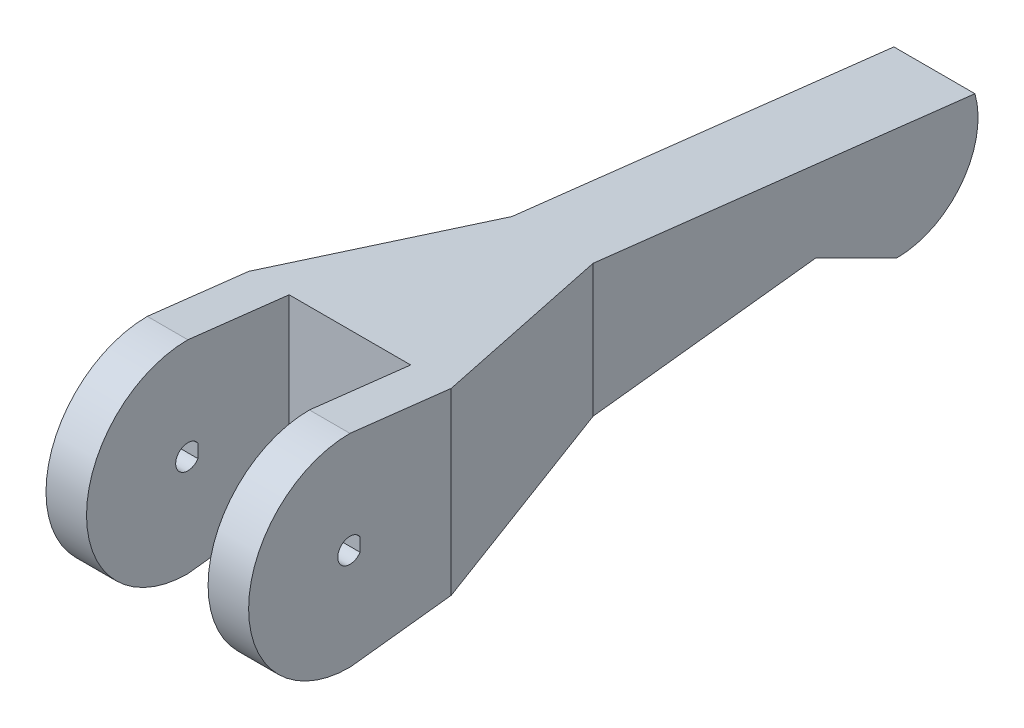
ISO-10303-21;
HEADER;
FILE_DESCRIPTION(('STEP AP214'),'2;1');
FILE_NAME('part.step','',(''),(''),'','','');
FILE_SCHEMA(('AUTOMOTIVE_DESIGN { 1 0 10303 214 1 1 1 1 }'));
ENDSEC;
DATA;
#1=APPLICATION_CONTEXT('core data for automotive mechanical design processes');
#2=APPLICATION_PROTOCOL_DEFINITION('international standard','automotive_design',2000,#1);
#3=PRODUCT_CONTEXT('',#1,'mechanical');
#4=PRODUCT('Part','Part','',(#3));
#5=PRODUCT_RELATED_PRODUCT_CATEGORY('part','',(#4));
#6=PRODUCT_DEFINITION_FORMATION('','',#4);
#7=PRODUCT_DEFINITION_CONTEXT('part definition',#1,'design');
#8=PRODUCT_DEFINITION('design','',#6,#7);
#9=PRODUCT_DEFINITION_SHAPE('','',#8);
#10=(LENGTH_UNIT() NAMED_UNIT(*) SI_UNIT(.MILLI.,.METRE.));
#11=(NAMED_UNIT(*) PLANE_ANGLE_UNIT() SI_UNIT($,.RADIAN.));
#12=(NAMED_UNIT(*) SI_UNIT($,.STERADIAN.) SOLID_ANGLE_UNIT());
#13=UNCERTAINTY_MEASURE_WITH_UNIT(LENGTH_MEASURE(1.E-05),#10,'distance_accuracy_value','');
#14=(GEOMETRIC_REPRESENTATION_CONTEXT(3) GLOBAL_UNCERTAINTY_ASSIGNED_CONTEXT((#13)) GLOBAL_UNIT_ASSIGNED_CONTEXT((#10,
#11,#12)) REPRESENTATION_CONTEXT('',''));
#15=CARTESIAN_POINT('',(0.,0.,0.));
#16=DIRECTION('',(0.,0.,1.));
#17=DIRECTION('',(1.,0.,0.));
#18=AXIS2_PLACEMENT_3D('',#15,#16,#17);
#19=CARTESIAN_POINT('',(50.,0.,0.));
#20=DIRECTION('',(-1.,0.,0.));
#21=DIRECTION('',(0.,0.,1.));
#22=AXIS2_PLACEMENT_3D('',#19,#20,#21);
#23=CYLINDRICAL_SURFACE('',#22,25.);
#24=DIRECTION('',(-1.,0.,0.));
#25=VECTOR('',#24,1.);
#26=CARTESIAN_POINT('',(50.,25.,0.));
#27=LINE('',#26,#25);
#28=CARTESIAN_POINT('',(50.,25.,0.));
#29=VERTEX_POINT('',#28);
#30=CARTESIAN_POINT('',(40.,25.,0.));
#31=VERTEX_POINT('',#30);
#32=EDGE_CURVE('E255',#29,#31,#27,.T.);
#33=ORIENTED_EDGE('',*,*,#32,.T.);
#34=CARTESIAN_POINT('',(40.,0.,0.));
#35=DIRECTION('',(1.,0.,0.));
#36=DIRECTION('',(0.,0.,-1.));
#37=AXIS2_PLACEMENT_3D('',#34,#35,#36);
#38=CIRCLE('',#37,25.);
#39=CARTESIAN_POINT('',(40.,-25.,0.));
#40=VERTEX_POINT('',#39);
#41=EDGE_CURVE('E196',#31,#40,#38,.T.);
#42=ORIENTED_EDGE('',*,*,#41,.T.);
#43=DIRECTION('',(-1.,0.,0.));
#44=VECTOR('',#43,1.);
#45=CARTESIAN_POINT('',(50.,-25.,0.));
#46=LINE('',#45,#44);
#47=CARTESIAN_POINT('',(50.,-25.,0.));
#48=VERTEX_POINT('',#47);
#49=EDGE_CURVE('E265',#48,#40,#46,.T.);
#50=ORIENTED_EDGE('',*,*,#49,.F.);
#51=CARTESIAN_POINT('',(50.,0.,0.));
#52=DIRECTION('',(1.,0.,0.));
#53=DIRECTION('',(0.,0.,-1.));
#54=AXIS2_PLACEMENT_3D('',#51,#52,#53);
#55=CIRCLE('',#54,25.);
#56=EDGE_CURVE('E238',#29,#48,#55,.T.);
#57=ORIENTED_EDGE('',*,*,#56,.F.);
#58=EDGE_LOOP('',(#33,#42,#50,#57));
#59=FACE_BOUND('',#58,.T.);
#60=ADVANCED_FACE('F37',(#59),#23,.T.);
#61=CARTESIAN_POINT('',(10.,0.,0.));
#62=DIRECTION('',(-1.,0.,0.));
#63=DIRECTION('',(0.,0.,1.));
#64=AXIS2_PLACEMENT_3D('',#61,#62,#63);
#65=CIRCLE('',#64,25.);
#66=CARTESIAN_POINT('',(10.,-25.,0.));
#67=VERTEX_POINT('',#66);
#68=CARTESIAN_POINT('',(10.,25.,0.));
#69=VERTEX_POINT('',#68);
#70=EDGE_CURVE('E191',#67,#69,#65,.T.);
#71=ORIENTED_EDGE('',*,*,#70,.T.);
#72=CARTESIAN_POINT('',(0.,25.,0.));
#73=VERTEX_POINT('',#72);
#74=EDGE_CURVE('E247',#69,#73,#27,.T.);
#75=ORIENTED_EDGE('',*,*,#74,.T.);
#76=CARTESIAN_POINT('',(0.,0.,0.));
#77=DIRECTION('',(1.,0.,0.));
#78=DIRECTION('',(0.,0.,-1.));
#79=AXIS2_PLACEMENT_3D('',#76,#77,#78);
#80=CIRCLE('',#79,25.);
#81=CARTESIAN_POINT('',(0.,-25.,0.));
#82=VERTEX_POINT('',#81);
#83=EDGE_CURVE('E237',#73,#82,#80,.T.);
#84=ORIENTED_EDGE('',*,*,#83,.T.);
#85=EDGE_CURVE('E264',#67,#82,#46,.T.);
#86=ORIENTED_EDGE('',*,*,#85,.F.);
#87=EDGE_LOOP('',(#71,#75,#84,#86));
#88=FACE_BOUND('',#87,.T.);
#89=ADVANCED_FACE('F39',(#88),#23,.T.);
#90=CARTESIAN_POINT('',(50.,-25.,0.));
#91=DIRECTION('',(0.,0.993408935871131,0.114624107985131));
#92=DIRECTION('',(0.,-0.114624107985131,0.993408935871131));
#93=AXIS2_PLACEMENT_3D('',#90,#91,#92);
#94=PLANE('',#93);
#95=ORIENTED_EDGE('',*,*,#49,.T.);
#96=DIRECTION('',(0.,0.114624107985131,-0.993408935871131));
#97=VECTOR('',#96,1.);
#98=CARTESIAN_POINT('',(40.,-25.,0.));
#99=LINE('',#98,#97);
#100=CARTESIAN_POINT('',(40.,-22.1153846153846,-25.));
#101=VERTEX_POINT('',#100);
#102=EDGE_CURVE('E199',#40,#101,#99,.T.);
#103=ORIENTED_EDGE('',*,*,#102,.T.);
#104=DIRECTION('',(-1.,0.,0.));
#105=VECTOR('',#104,1.);
#106=CARTESIAN_POINT('',(50.,-22.1153846153846,-25.));
#107=LINE('',#106,#105);
#108=CARTESIAN_POINT('',(10.,-22.1153846153846,-25.));
#109=VERTEX_POINT('',#108);
#110=EDGE_CURVE('E187',#101,#109,#107,.T.);
#111=ORIENTED_EDGE('',*,*,#110,.T.);
#112=DIRECTION('',(0.,-0.114624107985131,0.993408935871131));
#113=VECTOR('',#112,1.);
#114=CARTESIAN_POINT('',(10.,-25.,0.));
#115=LINE('',#114,#113);
#116=EDGE_CURVE('E193',#109,#67,#115,.T.);
#117=ORIENTED_EDGE('',*,*,#116,.T.);
#118=ORIENTED_EDGE('',*,*,#85,.T.);
#119=DIRECTION('',(0.,0.114624107985131,-0.993408935871131));
#120=VECTOR('',#119,1.);
#121=CARTESIAN_POINT('',(0.,-25.,0.));
#122=LINE('',#121,#120);
#123=CARTESIAN_POINT('',(0.,-22.1153846153846,-25.));
#124=VERTEX_POINT('',#123);
#125=EDGE_CURVE('E250',#82,#124,#122,.T.);
#126=ORIENTED_EDGE('',*,*,#125,.T.);
#127=DIRECTION('',(0.285608920060766,0.109849584638756,-0.952029733535889));
#128=VECTOR('',#127,1.);
#129=CARTESIAN_POINT('',(-2.80958382494904,-23.1959937788266,-15.6347205835031));
#130=LINE('',#129,#128);
#131=CARTESIAN_POINT('',(15.,-16.3461538461538,-75.));
#132=VERTEX_POINT('',#131);
#133=EDGE_CURVE('E211',#124,#132,#130,.T.);
#134=ORIENTED_EDGE('',*,*,#133,.T.);
#135=DIRECTION('',(0.,0.114624107985131,-0.993408935871131));
#136=VECTOR('',#135,1.);
#137=CARTESIAN_POINT('',(15.,-25.,0.));
#138=LINE('',#137,#136);
#139=CARTESIAN_POINT('',(15.,-10.,-130.));
#140=VERTEX_POINT('',#139);
#141=EDGE_CURVE('E234',#132,#140,#138,.T.);
#142=ORIENTED_EDGE('',*,*,#141,.T.);
#143=DIRECTION('',(-1.,0.,0.));
#144=VECTOR('',#143,1.);
#145=CARTESIAN_POINT('',(50.,-10.,-130.));
#146=LINE('',#145,#144);
#147=CARTESIAN_POINT('',(35.,-10.,-130.));
#148=VERTEX_POINT('',#147);
#149=EDGE_CURVE('E261',#148,#140,#146,.T.);
#150=ORIENTED_EDGE('',*,*,#149,.F.);
#151=DIRECTION('',(0.,-0.114624107985131,0.993408935871131));
#152=VECTOR('',#151,1.);
#153=CARTESIAN_POINT('',(35.,-25.,0.));
#154=LINE('',#153,#152);
#155=CARTESIAN_POINT('',(35.,-16.3461538461538,-75.));
#156=VERTEX_POINT('',#155);
#157=EDGE_CURVE('E225',#148,#156,#154,.T.);
#158=ORIENTED_EDGE('',*,*,#157,.T.);
#159=DIRECTION('',(0.285608920060766,-0.109849584638756,0.952029733535889));
#160=VECTOR('',#159,1.);
#161=CARTESIAN_POINT('',(56.8882065858629,-24.7646948407165,-2.03931138045693));
#162=LINE('',#161,#160);
#163=CARTESIAN_POINT('',(50.,-22.1153846153846,-25.));
#164=VERTEX_POINT('',#163);
#165=EDGE_CURVE('E217',#156,#164,#162,.T.);
#166=ORIENTED_EDGE('',*,*,#165,.T.);
#167=DIRECTION('',(0.,0.114624107985131,-0.993408935871131));
#168=VECTOR('',#167,1.);
#169=CARTESIAN_POINT('',(50.,-25.,0.));
#170=LINE('',#169,#168);
#171=EDGE_CURVE('E241',#48,#164,#170,.T.);
#172=ORIENTED_EDGE('',*,*,#171,.F.);
#173=EDGE_LOOP('',(#95,#103,#111,#117,#118,#126,#134,#142,#150,#158,#166,#172));
#174=FACE_BOUND('',#173,.T.);
#175=ADVANCED_FACE('F316',(#174),#94,.F.);
#176=CARTESIAN_POINT('',(50.,-10.,-130.));
#177=DIRECTION('',(0.,0.894427190999916,-0.447213595499958));
#178=DIRECTION('',(0.,0.447213595499958,0.894427190999916));
#179=AXIS2_PLACEMENT_3D('',#176,#177,#178);
#180=PLANE('',#179);
#181=ORIENTED_EDGE('',*,*,#149,.T.);
#182=DIRECTION('',(0.,-0.447213595499958,-0.894427190999916));
#183=VECTOR('',#182,1.);
#184=CARTESIAN_POINT('',(15.,-10.,-130.));
#185=LINE('',#184,#183);
#186=CARTESIAN_POINT('',(15.,-20.,-150.));
#187=VERTEX_POINT('',#186);
#188=EDGE_CURVE('E231',#140,#187,#185,.T.);
#189=ORIENTED_EDGE('',*,*,#188,.T.);
#190=DIRECTION('',(-1.,0.,0.));
#191=VECTOR('',#190,1.);
#192=CARTESIAN_POINT('',(50.,-20.,-150.));
#193=LINE('',#192,#191);
#194=CARTESIAN_POINT('',(35.,-20.,-150.));
#195=VERTEX_POINT('',#194);
#196=EDGE_CURVE('E258',#195,#187,#193,.T.);
#197=ORIENTED_EDGE('',*,*,#196,.F.);
#198=DIRECTION('',(0.,0.447213595499958,0.894427190999916));
#199=VECTOR('',#198,1.);
#200=CARTESIAN_POINT('',(35.,-10.,-130.));
#201=LINE('',#200,#199);
#202=EDGE_CURVE('E222',#195,#148,#201,.T.);
#203=ORIENTED_EDGE('',*,*,#202,.T.);
#204=EDGE_LOOP('',(#181,#189,#197,#203));
#205=FACE_BOUND('',#204,.T.);
#206=ADVANCED_FACE('F331',(#205),#180,.F.);
#207=CARTESIAN_POINT('',(50.,0.,-150.));
#208=DIRECTION('',(-1.,0.,0.));
#209=DIRECTION('',(0.,0.,1.));
#210=AXIS2_PLACEMENT_3D('',#207,#208,#209);
#211=CYLINDRICAL_SURFACE('',#210,20.);
#212=CARTESIAN_POINT('',(15.,0.,-150.));
#213=DIRECTION('',(1.,0.,0.));
#214=DIRECTION('',(0.,0.,-1.));
#215=AXIS2_PLACEMENT_3D('',#212,#213,#214);
#216=CIRCLE('',#215,20.);
#217=CARTESIAN_POINT('',(15.,5.47269139460768,-169.236674580067));
#218=VERTEX_POINT('',#217);
#219=EDGE_CURVE('E228',#187,#218,#216,.T.);
#220=ORIENTED_EDGE('',*,*,#219,.T.);
#221=DIRECTION('',(-1.,0.,0.));
#222=VECTOR('',#221,1.);
#223=CARTESIAN_POINT('',(50.,5.47269139460768,-169.236674580067));
#224=LINE('',#223,#222);
#225=CARTESIAN_POINT('',(35.,5.47269139460768,-169.236674580067));
#226=VERTEX_POINT('',#225);
#227=EDGE_CURVE('E180',#218,#226,#224,.F.);
#228=ORIENTED_EDGE('',*,*,#227,.T.);
#229=CARTESIAN_POINT('',(35.,0.,-150.));
#230=DIRECTION('',(-1.,0.,0.));
#231=DIRECTION('',(0.,0.,1.));
#232=AXIS2_PLACEMENT_3D('',#229,#230,#231);
#233=CIRCLE('',#232,20.);
#234=EDGE_CURVE('E220',#226,#195,#233,.T.);
#235=ORIENTED_EDGE('',*,*,#234,.T.);
#236=ORIENTED_EDGE('',*,*,#196,.T.);
#237=EDGE_LOOP('',(#220,#228,#235,#236));
#238=FACE_BOUND('',#237,.T.);
#239=ADVANCED_FACE('F326',(#238),#211,.T.);
#240=CARTESIAN_POINT('',(50.,25.,0.));
#241=DIRECTION('',(0.,-0.993408935871131,0.114624107985131));
#242=DIRECTION('',(0.,-0.114624107985131,-0.993408935871131));
#243=AXIS2_PLACEMENT_3D('',#240,#241,#242);
#244=PLANE('',#243);
#245=DIRECTION('',(1.,0.,0.));
#246=VECTOR('',#245,1.);
#247=CARTESIAN_POINT('',(50.,22.1153846153846,-25.));
#248=LINE('',#247,#246);
#249=CARTESIAN_POINT('',(10.,22.1153846153846,-25.));
#250=VERTEX_POINT('',#249);
#251=CARTESIAN_POINT('',(40.,22.1153846153846,-25.));
#252=VERTEX_POINT('',#251);
#253=EDGE_CURVE('E278',#250,#252,#248,.T.);
#254=ORIENTED_EDGE('',*,*,#253,.T.);
#255=DIRECTION('',(0.,0.114624107985131,0.993408935871131));
#256=VECTOR('',#255,1.);
#257=CARTESIAN_POINT('',(40.,25.,0.));
#258=LINE('',#257,#256);
#259=EDGE_CURVE('E284',#252,#31,#258,.T.);
#260=ORIENTED_EDGE('',*,*,#259,.T.);
#261=ORIENTED_EDGE('',*,*,#32,.F.);
#262=DIRECTION('',(0.,0.114624107985131,0.993408935871131));
#263=VECTOR('',#262,1.);
#264=CARTESIAN_POINT('',(50.,25.,0.));
#265=LINE('',#264,#263);
#266=CARTESIAN_POINT('',(50.,22.1153846153846,-25.));
#267=VERTEX_POINT('',#266);
#268=EDGE_CURVE('E245',#267,#29,#265,.T.);
#269=ORIENTED_EDGE('',*,*,#268,.F.);
#270=DIRECTION('',(-0.285608920060766,-0.109849584638756,-0.952029733535889));
#271=VECTOR('',#270,1.);
#272=CARTESIAN_POINT('',(56.8882065858629,24.7646948407165,-2.03931138045693));
#273=LINE('',#272,#271);
#274=CARTESIAN_POINT('',(35.,16.3461538461538,-75.));
#275=VERTEX_POINT('',#274);
#276=EDGE_CURVE('E214',#267,#275,#273,.T.);
#277=ORIENTED_EDGE('',*,*,#276,.T.);
#278=DIRECTION('',(0.,-0.114624107985131,-0.993408935871131));
#279=VECTOR('',#278,1.);
#280=CARTESIAN_POINT('',(35.,25.,0.));
#281=LINE('',#280,#279);
#282=EDGE_CURVE('E273',#275,#226,#281,.T.);
#283=ORIENTED_EDGE('',*,*,#282,.T.);
#284=ORIENTED_EDGE('',*,*,#227,.F.);
#285=DIRECTION('',(0.,0.114624107985131,0.993408935871131));
#286=VECTOR('',#285,1.);
#287=CARTESIAN_POINT('',(15.,25.,0.));
#288=LINE('',#287,#286);
#289=CARTESIAN_POINT('',(15.,16.3461538461538,-75.));
#290=VERTEX_POINT('',#289);
#291=EDGE_CURVE('E275',#218,#290,#288,.T.);
#292=ORIENTED_EDGE('',*,*,#291,.T.);
#293=DIRECTION('',(-0.285608920060766,0.109849584638756,0.952029733535889));
#294=VECTOR('',#293,1.);
#295=CARTESIAN_POINT('',(-2.80958382494904,23.1959937788266,-15.6347205835031));
#296=LINE('',#295,#294);
#297=CARTESIAN_POINT('',(0.,22.1153846153846,-25.));
#298=VERTEX_POINT('',#297);
#299=EDGE_CURVE('E206',#290,#298,#296,.T.);
#300=ORIENTED_EDGE('',*,*,#299,.T.);
#301=DIRECTION('',(0.,0.114624107985131,0.993408935871131));
#302=VECTOR('',#301,1.);
#303=CARTESIAN_POINT('',(0.,25.,0.));
#304=LINE('',#303,#302);
#305=EDGE_CURVE('E242',#298,#73,#304,.T.);
#306=ORIENTED_EDGE('',*,*,#305,.T.);
#307=ORIENTED_EDGE('',*,*,#74,.F.);
#308=DIRECTION('',(0.,-0.114624107985131,-0.993408935871131));
#309=VECTOR('',#308,1.);
#310=CARTESIAN_POINT('',(10.,25.,0.));
#311=LINE('',#310,#309);
#312=EDGE_CURVE('E281',#69,#250,#311,.T.);
#313=ORIENTED_EDGE('',*,*,#312,.T.);
#314=EDGE_LOOP('',(#254,#260,#261,#269,#277,#283,#284,#292,#300,#306,#307,#313));
#315=FACE_BOUND('',#314,.T.);
#316=ADVANCED_FACE('F304',(#315),#244,.F.);
#317=CARTESIAN_POINT('',(50.,0.,0.));
#318=DIRECTION('',(1.,0.,0.));
#319=DIRECTION('',(0.,0.,-1.));
#320=AXIS2_PLACEMENT_3D('',#317,#318,#319);
#321=PLANE('',#320);
#322=CARTESIAN_POINT('',(50.,0.,0.));
#323=DIRECTION('',(-1.,0.,0.));
#324=DIRECTION('',(0.,0.,1.));
#325=AXIS2_PLACEMENT_3D('',#322,#323,#324);
#326=CIRCLE('',#325,3.);
#327=CARTESIAN_POINT('',(50.,-1.6583123951777,-2.5));
#328=VERTEX_POINT('',#327);
#329=CARTESIAN_POINT('',(50.,1.6583123951777,-2.5));
#330=VERTEX_POINT('',#329);
#331=EDGE_CURVE('E55',#328,#330,#326,.T.);
#332=ORIENTED_EDGE('',*,*,#331,.T.);
#333=DIRECTION('',(0.,-1.,0.));
#334=VECTOR('',#333,1.);
#335=CARTESIAN_POINT('',(50.,1.6583123951777,-2.5));
#336=LINE('',#335,#334);
#337=EDGE_CURVE('E166',#330,#328,#336,.T.);
#338=ORIENTED_EDGE('',*,*,#337,.T.);
#339=EDGE_LOOP('',(#332,#338));
#340=FACE_BOUND('',#339,.T.);
#341=DIRECTION('',(0.,-1.,0.));
#342=VECTOR('',#341,1.);
#343=CARTESIAN_POINT('',(50.,0.,-25.));
#344=LINE('',#343,#342);
#345=EDGE_CURVE('E271',#267,#164,#344,.T.);
#346=ORIENTED_EDGE('',*,*,#345,.F.);
#347=ORIENTED_EDGE('',*,*,#268,.T.);
#348=ORIENTED_EDGE('',*,*,#56,.T.);
#349=ORIENTED_EDGE('',*,*,#171,.T.);
#350=EDGE_LOOP('',(#346,#347,#348,#349));
#351=FACE_BOUND('',#350,.T.);
#352=ADVANCED_FACE('F300',(#340,#351),#321,.T.);
#353=CARTESIAN_POINT('',(0.,0.,0.));
#354=DIRECTION('',(1.,0.,0.));
#355=DIRECTION('',(0.,0.,-1.));
#356=AXIS2_PLACEMENT_3D('',#353,#354,#355);
#357=PLANE('',#356);
#358=DIRECTION('',(0.,1.,0.));
#359=VECTOR('',#358,1.);
#360=CARTESIAN_POINT('',(0.,1.6583123951777,-2.5));
#361=LINE('',#360,#359);
#362=CARTESIAN_POINT('',(0.,1.6583123951777,-2.5));
#363=VERTEX_POINT('',#362);
#364=CARTESIAN_POINT('',(0.,-1.6583123951777,-2.5));
#365=VERTEX_POINT('',#364);
#366=EDGE_CURVE('E68',#363,#365,#361,.F.);
#367=ORIENTED_EDGE('',*,*,#366,.F.);
#368=CARTESIAN_POINT('',(0.,0.,0.));
#369=DIRECTION('',(-1.,0.,0.));
#370=DIRECTION('',(0.,0.,1.));
#371=AXIS2_PLACEMENT_3D('',#368,#369,#370);
#372=CIRCLE('',#371,3.);
#373=EDGE_CURVE('E41',#365,#363,#372,.T.);
#374=ORIENTED_EDGE('',*,*,#373,.F.);
#375=EDGE_LOOP('',(#367,#374));
#376=FACE_BOUND('',#375,.T.);
#377=ORIENTED_EDGE('',*,*,#305,.F.);
#378=DIRECTION('',(0.,-1.,0.));
#379=VECTOR('',#378,1.);
#380=CARTESIAN_POINT('',(0.,0.,-25.));
#381=LINE('',#380,#379);
#382=EDGE_CURVE('E268',#298,#124,#381,.T.);
#383=ORIENTED_EDGE('',*,*,#382,.T.);
#384=ORIENTED_EDGE('',*,*,#125,.F.);
#385=ORIENTED_EDGE('',*,*,#83,.F.);
#386=EDGE_LOOP('',(#377,#383,#384,#385));
#387=FACE_BOUND('',#386,.T.);
#388=ADVANCED_FACE('F303',(#376,#387),#357,.F.);
#389=CARTESIAN_POINT('',(15.,-25.,-75.));
#390=DIRECTION('',(0.957826285221152,0.,0.287347885566345));
#391=DIRECTION('',(0.287347885566345,0.,-0.957826285221152));
#392=AXIS2_PLACEMENT_3D('',#389,#390,#391);
#393=PLANE('',#392);
#394=ORIENTED_EDGE('',*,*,#382,.F.);
#395=ORIENTED_EDGE('',*,*,#299,.F.);
#396=DIRECTION('',(0.,1.,0.));
#397=VECTOR('',#396,1.);
#398=CARTESIAN_POINT('',(15.,-25.,-75.));
#399=LINE('',#398,#397);
#400=EDGE_CURVE('E203',#132,#290,#399,.T.);
#401=ORIENTED_EDGE('',*,*,#400,.F.);
#402=ORIENTED_EDGE('',*,*,#133,.F.);
#403=EDGE_LOOP('',(#394,#395,#401,#402));
#404=FACE_BOUND('',#403,.T.);
#405=ADVANCED_FACE('F334',(#404),#393,.F.);
#406=CARTESIAN_POINT('',(15.,-25.,-170.));
#407=DIRECTION('',(1.,0.,0.));
#408=DIRECTION('',(0.,0.,-1.));
#409=AXIS2_PLACEMENT_3D('',#406,#407,#408);
#410=PLANE('',#409);
#411=ORIENTED_EDGE('',*,*,#291,.F.);
#412=ORIENTED_EDGE('',*,*,#219,.F.);
#413=ORIENTED_EDGE('',*,*,#188,.F.);
#414=ORIENTED_EDGE('',*,*,#141,.F.);
#415=ORIENTED_EDGE('',*,*,#400,.T.);
#416=EDGE_LOOP('',(#411,#412,#413,#414,#415));
#417=FACE_BOUND('',#416,.T.);
#418=ADVANCED_FACE('F329',(#417),#410,.F.);
#419=CARTESIAN_POINT('',(35.,-25.,-170.));
#420=DIRECTION('',(-1.,0.,0.));
#421=DIRECTION('',(0.,0.,1.));
#422=AXIS2_PLACEMENT_3D('',#419,#420,#421);
#423=PLANE('',#422);
#424=ORIENTED_EDGE('',*,*,#234,.F.);
#425=ORIENTED_EDGE('',*,*,#282,.F.);
#426=DIRECTION('',(0.,1.,0.));
#427=VECTOR('',#426,1.);
#428=CARTESIAN_POINT('',(35.,-25.,-75.));
#429=LINE('',#428,#427);
#430=EDGE_CURVE('E202',#156,#275,#429,.T.);
#431=ORIENTED_EDGE('',*,*,#430,.F.);
#432=ORIENTED_EDGE('',*,*,#157,.F.);
#433=ORIENTED_EDGE('',*,*,#202,.F.);
#434=EDGE_LOOP('',(#424,#425,#431,#432,#433));
#435=FACE_BOUND('',#434,.T.);
#436=ADVANCED_FACE('F322',(#435),#423,.F.);
#437=CARTESIAN_POINT('',(35.,-25.,-75.));
#438=DIRECTION('',(-0.957826285221152,0.,0.287347885566345));
#439=DIRECTION('',(0.287347885566345,0.,0.957826285221152));
#440=AXIS2_PLACEMENT_3D('',#437,#438,#439);
#441=PLANE('',#440);
#442=ORIENTED_EDGE('',*,*,#430,.T.);
#443=ORIENTED_EDGE('',*,*,#276,.F.);
#444=ORIENTED_EDGE('',*,*,#345,.T.);
#445=ORIENTED_EDGE('',*,*,#165,.F.);
#446=EDGE_LOOP('',(#442,#443,#444,#445));
#447=FACE_BOUND('',#446,.T.);
#448=ADVANCED_FACE('F319',(#447),#441,.F.);
#449=CARTESIAN_POINT('',(40.,-25.,25.));
#450=DIRECTION('',(1.,0.,0.));
#451=DIRECTION('',(0.,0.,-1.));
#452=AXIS2_PLACEMENT_3D('',#449,#450,#451);
#453=PLANE('',#452);
#454=DIRECTION('',(0.,1.,0.));
#455=VECTOR('',#454,1.);
#456=CARTESIAN_POINT('',(40.,-25.,-2.5));
#457=LINE('',#456,#455);
#458=CARTESIAN_POINT('',(40.,-1.6583123951777,-2.5));
#459=VERTEX_POINT('',#458);
#460=CARTESIAN_POINT('',(40.,1.6583123951777,-2.5));
#461=VERTEX_POINT('',#460);
#462=EDGE_CURVE('E79',#459,#461,#457,.T.);
#463=ORIENTED_EDGE('',*,*,#462,.T.);
#464=CARTESIAN_POINT('',(40.,0.,0.));
#465=DIRECTION('',(1.,0.,0.));
#466=DIRECTION('',(0.,0.,-1.));
#467=AXIS2_PLACEMENT_3D('',#464,#465,#466);
#468=CIRCLE('',#467,3.);
#469=EDGE_CURVE('E170',#461,#459,#468,.T.);
#470=ORIENTED_EDGE('',*,*,#469,.T.);
#471=EDGE_LOOP('',(#463,#470));
#472=FACE_BOUND('',#471,.T.);
#473=ORIENTED_EDGE('',*,*,#41,.F.);
#474=ORIENTED_EDGE('',*,*,#259,.F.);
#475=DIRECTION('',(0.,1.,0.));
#476=VECTOR('',#475,1.);
#477=CARTESIAN_POINT('',(40.,-25.,-25.));
#478=LINE('',#477,#476);
#479=EDGE_CURVE('E183',#101,#252,#478,.T.);
#480=ORIENTED_EDGE('',*,*,#479,.F.);
#481=ORIENTED_EDGE('',*,*,#102,.F.);
#482=EDGE_LOOP('',(#473,#474,#480,#481));
#483=FACE_BOUND('',#482,.T.);
#484=ADVANCED_FACE('F175',(#472,#483),#453,.F.);
#485=CARTESIAN_POINT('',(10.,-25.,25.));
#486=DIRECTION('',(-1.,0.,0.));
#487=DIRECTION('',(0.,0.,1.));
#488=AXIS2_PLACEMENT_3D('',#485,#486,#487);
#489=PLANE('',#488);
#490=DIRECTION('',(0.,-1.,0.));
#491=VECTOR('',#490,1.);
#492=CARTESIAN_POINT('',(10.,-25.,-2.5));
#493=LINE('',#492,#491);
#494=CARTESIAN_POINT('',(10.,1.6583123951777,-2.5));
#495=VERTEX_POINT('',#494);
#496=CARTESIAN_POINT('',(10.,-1.6583123951777,-2.5));
#497=VERTEX_POINT('',#496);
#498=EDGE_CURVE('E47',#495,#497,#493,.T.);
#499=ORIENTED_EDGE('',*,*,#498,.T.);
#500=CARTESIAN_POINT('',(10.,0.,0.));
#501=DIRECTION('',(-1.,0.,0.));
#502=DIRECTION('',(0.,0.,1.));
#503=AXIS2_PLACEMENT_3D('',#500,#501,#502);
#504=CIRCLE('',#503,3.);
#505=EDGE_CURVE('E11',#497,#495,#504,.T.);
#506=ORIENTED_EDGE('',*,*,#505,.T.);
#507=EDGE_LOOP('',(#499,#506));
#508=FACE_BOUND('',#507,.T.);
#509=DIRECTION('',(0.,1.,0.));
#510=VECTOR('',#509,1.);
#511=CARTESIAN_POINT('',(10.,-25.,-25.));
#512=LINE('',#511,#510);
#513=EDGE_CURVE('E184',#109,#250,#512,.T.);
#514=ORIENTED_EDGE('',*,*,#513,.T.);
#515=ORIENTED_EDGE('',*,*,#312,.F.);
#516=ORIENTED_EDGE('',*,*,#70,.F.);
#517=ORIENTED_EDGE('',*,*,#116,.F.);
#518=EDGE_LOOP('',(#514,#515,#516,#517));
#519=FACE_BOUND('',#518,.T.);
#520=ADVANCED_FACE('F289',(#508,#519),#489,.F.);
#521=CARTESIAN_POINT('',(40.,-25.,-25.));
#522=DIRECTION('',(0.,0.,-1.));
#523=DIRECTION('',(-1.,0.,0.));
#524=AXIS2_PLACEMENT_3D('',#521,#522,#523);
#525=PLANE('',#524);
#526=ORIENTED_EDGE('',*,*,#479,.T.);
#527=ORIENTED_EDGE('',*,*,#253,.F.);
#528=ORIENTED_EDGE('',*,*,#513,.F.);
#529=ORIENTED_EDGE('',*,*,#110,.F.);
#530=EDGE_LOOP('',(#526,#527,#528,#529));
#531=FACE_BOUND('',#530,.T.);
#532=ADVANCED_FACE('F345',(#531),#525,.F.);
#533=CARTESIAN_POINT('',(50.,1.6583123951777,-2.5));
#534=DIRECTION('',(0.,0.,-1.));
#535=DIRECTION('',(-1.,0.,0.));
#536=AXIS2_PLACEMENT_3D('',#533,#534,#535);
#537=PLANE('',#536);
#538=DIRECTION('',(-1.,0.,0.));
#539=VECTOR('',#538,1.);
#540=CARTESIAN_POINT('',(50.,-1.6583123951777,-2.5));
#541=LINE('',#540,#539);
#542=EDGE_CURVE('E159',#497,#365,#541,.T.);
#543=ORIENTED_EDGE('',*,*,#542,.F.);
#544=ORIENTED_EDGE('',*,*,#498,.F.);
#545=DIRECTION('',(-1.,0.,0.));
#546=VECTOR('',#545,1.);
#547=CARTESIAN_POINT('',(50.,1.6583123951777,-2.5));
#548=LINE('',#547,#546);
#549=EDGE_CURVE('E167',#495,#363,#548,.T.);
#550=ORIENTED_EDGE('',*,*,#549,.T.);
#551=ORIENTED_EDGE('',*,*,#366,.T.);
#552=EDGE_LOOP('',(#543,#544,#550,#551));
#553=FACE_BOUND('',#552,.T.);
#554=ADVANCED_FACE('F292',(#553),#537,.F.);
#555=CARTESIAN_POINT('',(50.,0.,0.));
#556=DIRECTION('',(-1.,0.,0.));
#557=DIRECTION('',(0.,0.,1.));
#558=AXIS2_PLACEMENT_3D('',#555,#556,#557);
#559=CYLINDRICAL_SURFACE('',#558,3.);
#560=ORIENTED_EDGE('',*,*,#549,.F.);
#561=ORIENTED_EDGE('',*,*,#505,.F.);
#562=ORIENTED_EDGE('',*,*,#542,.T.);
#563=ORIENTED_EDGE('',*,*,#373,.T.);
#564=EDGE_LOOP('',(#560,#561,#562,#563));
#565=FACE_BOUND('',#564,.T.);
#566=ADVANCED_FACE('F295',(#565),#559,.F.);
#567=EDGE_CURVE('E162',#330,#461,#548,.T.);
#568=ORIENTED_EDGE('',*,*,#567,.F.);
#569=ORIENTED_EDGE('',*,*,#331,.F.);
#570=EDGE_CURVE('E172',#328,#459,#541,.T.);
#571=ORIENTED_EDGE('',*,*,#570,.T.);
#572=ORIENTED_EDGE('',*,*,#469,.F.);
#573=EDGE_LOOP('',(#568,#569,#571,#572));
#574=FACE_BOUND('',#573,.T.);
#575=ADVANCED_FACE('F171',(#574),#559,.F.);
#576=ORIENTED_EDGE('',*,*,#570,.F.);
#577=ORIENTED_EDGE('',*,*,#337,.F.);
#578=ORIENTED_EDGE('',*,*,#567,.T.);
#579=ORIENTED_EDGE('',*,*,#462,.F.);
#580=EDGE_LOOP('',(#576,#577,#578,#579));
#581=FACE_BOUND('',#580,.T.);
#582=ADVANCED_FACE('F164',(#581),#537,.F.);
#583=CLOSED_SHELL('',(#60,#89,#175,#206,#239,#316,#352,#388,#405,#418,#436,#448,#484,#520,#532,
#554,#566,#575,#582));
#584=MANIFOLD_SOLID_BREP('B2',#583);
#585=ADVANCED_BREP_SHAPE_REPRESENTATION('',(#18,#584),#14);
#586=SHAPE_DEFINITION_REPRESENTATION(#9,#585);
ENDSEC;
END-ISO-10303-21;
